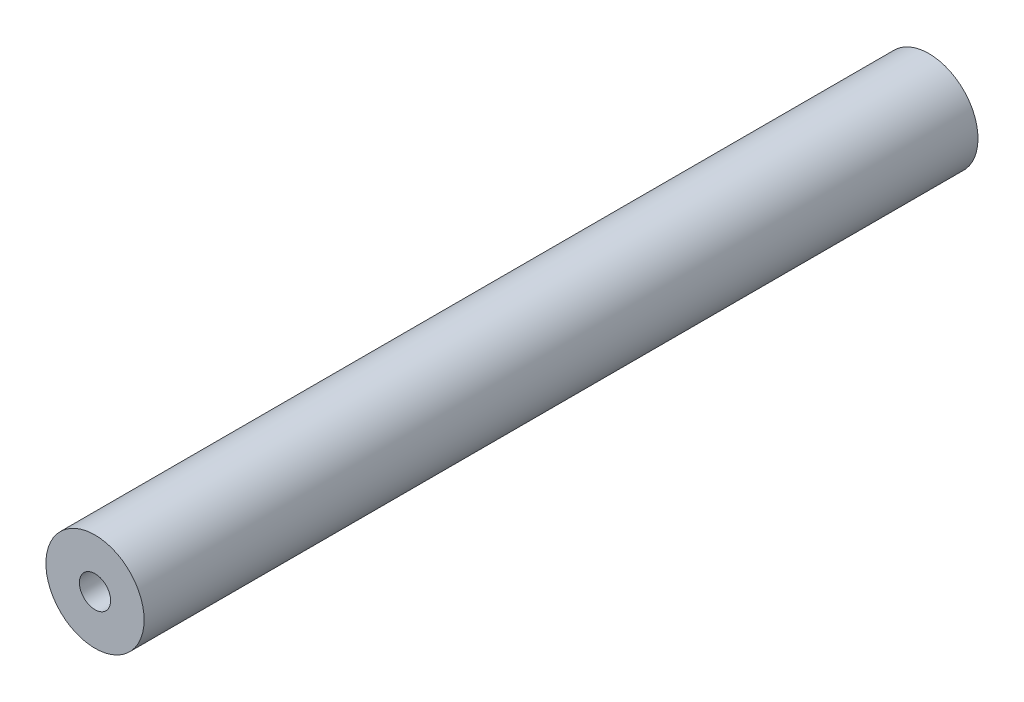
ISO-10303-21;
HEADER;
FILE_DESCRIPTION(('STEP AP214'),'2;1');
FILE_NAME('part.step','',(''),(''),'','','');
FILE_SCHEMA(('AUTOMOTIVE_DESIGN { 1 0 10303 214 1 1 1 1 }'));
ENDSEC;
DATA;
#1=APPLICATION_CONTEXT('core data for automotive mechanical design processes');
#2=APPLICATION_PROTOCOL_DEFINITION('international standard','automotive_design',2000,#1);
#3=PRODUCT_CONTEXT('',#1,'mechanical');
#4=PRODUCT('Part','Part','',(#3));
#5=PRODUCT_RELATED_PRODUCT_CATEGORY('part','',(#4));
#6=PRODUCT_DEFINITION_FORMATION('','',#4);
#7=PRODUCT_DEFINITION_CONTEXT('part definition',#1,'design');
#8=PRODUCT_DEFINITION('design','',#6,#7);
#9=PRODUCT_DEFINITION_SHAPE('','',#8);
#10=(LENGTH_UNIT() NAMED_UNIT(*) SI_UNIT(.MILLI.,.METRE.));
#11=(NAMED_UNIT(*) PLANE_ANGLE_UNIT() SI_UNIT($,.RADIAN.));
#12=(NAMED_UNIT(*) SI_UNIT($,.STERADIAN.) SOLID_ANGLE_UNIT());
#13=UNCERTAINTY_MEASURE_WITH_UNIT(LENGTH_MEASURE(1.E-05),#10,'distance_accuracy_value','');
#14=(GEOMETRIC_REPRESENTATION_CONTEXT(3) GLOBAL_UNCERTAINTY_ASSIGNED_CONTEXT((#13)) GLOBAL_UNIT_ASSIGNED_CONTEXT((#10,
#11,#12)) REPRESENTATION_CONTEXT('',''));
#15=CARTESIAN_POINT('',(0.,0.,0.));
#16=DIRECTION('',(0.,0.,1.));
#17=DIRECTION('',(1.,0.,0.));
#18=AXIS2_PLACEMENT_3D('',#15,#16,#17);
#19=CARTESIAN_POINT('',(0.,0.,107.8484));
#20=DIRECTION('',(0.,0.,-1.));
#21=DIRECTION('',(-1.,0.,0.));
#22=AXIS2_PLACEMENT_3D('',#19,#20,#21);
#23=CYLINDRICAL_SURFACE('',#22,6.35);
#24=CARTESIAN_POINT('',(0.,0.,107.8484));
#25=DIRECTION('',(0.,0.,1.));
#26=DIRECTION('',(1.,0.,0.));
#27=AXIS2_PLACEMENT_3D('',#24,#25,#26);
#28=CIRCLE('',#27,6.35);
#29=CARTESIAN_POINT('',(6.35,0.,107.8484));
#30=VERTEX_POINT('',#29);
#31=EDGE_CURVE('E11',#30,#30,#28,.T.);
#32=ORIENTED_EDGE('',*,*,#31,.F.);
#33=EDGE_LOOP('',(#32));
#34=FACE_BOUND('',#33,.T.);
#35=CARTESIAN_POINT('',(0.,0.,0.));
#36=DIRECTION('',(0.,0.,1.));
#37=DIRECTION('',(1.,0.,0.));
#38=AXIS2_PLACEMENT_3D('',#35,#36,#37);
#39=CIRCLE('',#38,6.35);
#40=CARTESIAN_POINT('',(6.35,0.,0.));
#41=VERTEX_POINT('',#40);
#42=EDGE_CURVE('E44',#41,#41,#39,.T.);
#43=ORIENTED_EDGE('',*,*,#42,.T.);
#44=EDGE_LOOP('',(#43));
#45=FACE_BOUND('',#44,.T.);
#46=ADVANCED_FACE('F41',(#34,#45),#23,.T.);
#47=CARTESIAN_POINT('',(0.,0.,107.8484));
#48=DIRECTION('',(0.,0.,1.));
#49=DIRECTION('',(1.,0.,0.));
#50=AXIS2_PLACEMENT_3D('',#47,#48,#49);
#51=PLANE('',#50);
#52=CARTESIAN_POINT('',(0.,0.,107.8484));
#53=DIRECTION('',(0.,0.,1.));
#54=DIRECTION('',(1.,0.,0.));
#55=AXIS2_PLACEMENT_3D('',#52,#53,#54);
#56=CIRCLE('',#55,2.0193);
#57=CARTESIAN_POINT('',(2.0193,0.,107.8484));
#58=VERTEX_POINT('',#57);
#59=EDGE_CURVE('E64',#58,#58,#56,.T.);
#60=ORIENTED_EDGE('',*,*,#59,.F.);
#61=EDGE_LOOP('',(#60));
#62=FACE_BOUND('',#61,.T.);
#63=ORIENTED_EDGE('',*,*,#31,.T.);
#64=EDGE_LOOP('',(#63));
#65=FACE_BOUND('',#64,.T.);
#66=ADVANCED_FACE('F83',(#62,#65),#51,.T.);
#67=CARTESIAN_POINT('',(0.,0.,0.));
#68=DIRECTION('',(0.,0.,1.));
#69=DIRECTION('',(1.,0.,0.));
#70=AXIS2_PLACEMENT_3D('',#67,#68,#69);
#71=PLANE('',#70);
#72=CARTESIAN_POINT('',(0.,0.,0.));
#73=DIRECTION('',(0.,0.,-1.));
#74=DIRECTION('',(-1.,0.,0.));
#75=AXIS2_PLACEMENT_3D('',#72,#73,#74);
#76=CIRCLE('',#75,2.0193);
#77=CARTESIAN_POINT('',(-2.0193,0.,0.));
#78=VERTEX_POINT('',#77);
#79=EDGE_CURVE('E65',#78,#78,#76,.T.);
#80=ORIENTED_EDGE('',*,*,#79,.F.);
#81=EDGE_LOOP('',(#80));
#82=FACE_BOUND('',#81,.T.);
#83=ORIENTED_EDGE('',*,*,#42,.F.);
#84=EDGE_LOOP('',(#83));
#85=FACE_BOUND('',#84,.T.);
#86=ADVANCED_FACE('F80',(#82,#85),#71,.F.);
#87=CARTESIAN_POINT('',(0.,0.,97.9424));
#88=DIRECTION('',(0.,0.,1.));
#89=DIRECTION('',(1.,0.,0.));
#90=AXIS2_PLACEMENT_3D('',#87,#88,#89);
#91=CONICAL_SURFACE('',#90,2.0193,1.02974425867665);
#92=CARTESIAN_POINT('',(0.,0.,96.7290821519977));
#93=VERTEX_POINT('',#92);
#94=VERTEX_LOOP('',#93);
#95=FACE_BOUND('',#94,.T.);
#96=CARTESIAN_POINT('',(0.,0.,97.9424));
#97=DIRECTION('',(0.,0.,1.));
#98=DIRECTION('',(1.,0.,0.));
#99=AXIS2_PLACEMENT_3D('',#96,#97,#98);
#100=CIRCLE('',#99,2.0193);
#101=CARTESIAN_POINT('',(2.0193,0.,97.9424));
#102=VERTEX_POINT('',#101);
#103=EDGE_CURVE('E68',#102,#102,#100,.T.);
#104=ORIENTED_EDGE('',*,*,#103,.T.);
#105=EDGE_LOOP('',(#104));
#106=FACE_BOUND('',#105,.T.);
#107=ADVANCED_FACE('F82',(#95,#106),#91,.F.);
#108=CARTESIAN_POINT('',(0.,0.,107.8484));
#109=DIRECTION('',(0.,0.,1.));
#110=DIRECTION('',(1.,0.,0.));
#111=AXIS2_PLACEMENT_3D('',#108,#109,#110);
#112=CYLINDRICAL_SURFACE('',#111,2.0193);
#113=ORIENTED_EDGE('',*,*,#103,.F.);
#114=EDGE_LOOP('',(#113));
#115=FACE_BOUND('',#114,.T.);
#116=ORIENTED_EDGE('',*,*,#59,.T.);
#117=EDGE_LOOP('',(#116));
#118=FACE_BOUND('',#117,.T.);
#119=ADVANCED_FACE('F58',(#115,#118),#112,.F.);
#120=CARTESIAN_POINT('',(0.,0.,11.938));
#121=DIRECTION('',(0.,0.,-1.));
#122=DIRECTION('',(-1.,0.,0.));
#123=AXIS2_PLACEMENT_3D('',#120,#121,#122);
#124=CONICAL_SURFACE('',#123,2.0193,1.02974425867665);
#125=CARTESIAN_POINT('',(0.,0.,13.1513178480024));
#126=VERTEX_POINT('',#125);
#127=VERTEX_LOOP('',#126);
#128=FACE_BOUND('',#127,.T.);
#129=CARTESIAN_POINT('',(0.,0.,11.938));
#130=DIRECTION('',(0.,0.,-1.));
#131=DIRECTION('',(-1.,0.,0.));
#132=AXIS2_PLACEMENT_3D('',#129,#130,#131);
#133=CIRCLE('',#132,2.0193);
#134=CARTESIAN_POINT('',(-2.0193,0.,11.938));
#135=VERTEX_POINT('',#134);
#136=EDGE_CURVE('E62',#135,#135,#133,.T.);
#137=ORIENTED_EDGE('',*,*,#136,.T.);
#138=EDGE_LOOP('',(#137));
#139=FACE_BOUND('',#138,.T.);
#140=ADVANCED_FACE('F54',(#128,#139),#124,.F.);
#141=CARTESIAN_POINT('',(0.,0.,0.));
#142=DIRECTION('',(0.,0.,-1.));
#143=DIRECTION('',(-1.,0.,0.));
#144=AXIS2_PLACEMENT_3D('',#141,#142,#143);
#145=CYLINDRICAL_SURFACE('',#144,2.0193);
#146=ORIENTED_EDGE('',*,*,#136,.F.);
#147=EDGE_LOOP('',(#146));
#148=FACE_BOUND('',#147,.T.);
#149=ORIENTED_EDGE('',*,*,#79,.T.);
#150=EDGE_LOOP('',(#149));
#151=FACE_BOUND('',#150,.T.);
#152=ADVANCED_FACE('F57',(#148,#151),#145,.F.);
#153=CLOSED_SHELL('',(#46,#66,#86,#107,#119,#140,#152));
#154=MANIFOLD_SOLID_BREP('B2',#153);
#155=ADVANCED_BREP_SHAPE_REPRESENTATION('',(#18,#154),#14);
#156=SHAPE_DEFINITION_REPRESENTATION(#9,#155);
ENDSEC;
END-ISO-10303-21;
